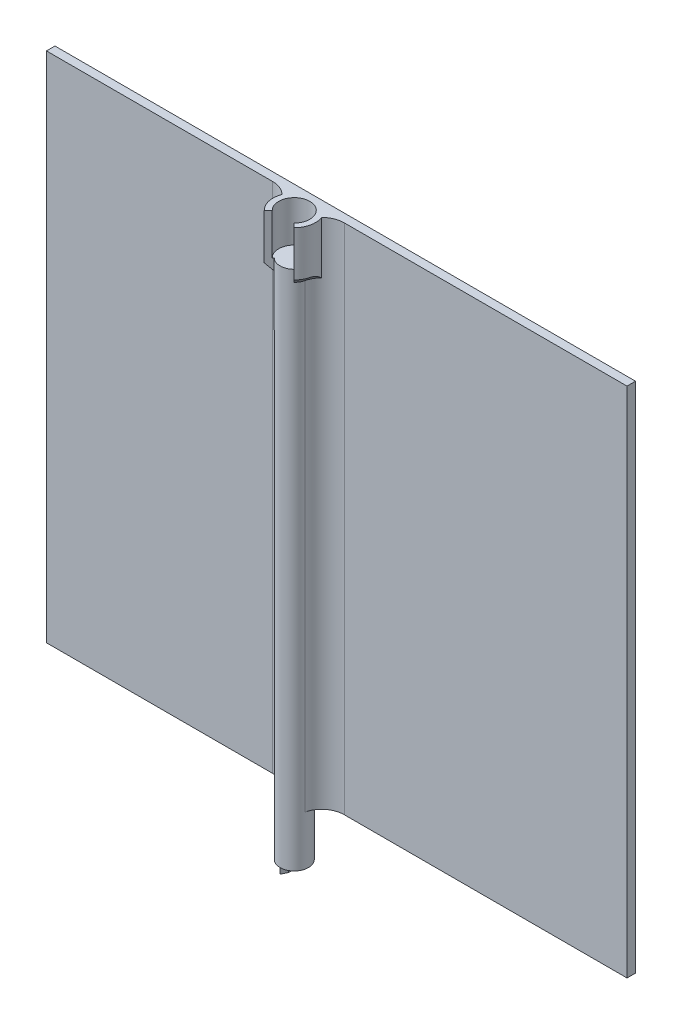
ISO-10303-21;
HEADER;
FILE_DESCRIPTION(('STEP AP214'),'2;1');
FILE_NAME('part.step','',(''),(''),'','','');
FILE_SCHEMA(('AUTOMOTIVE_DESIGN { 1 0 10303 214 1 1 1 1 }'));
ENDSEC;
DATA;
#1=APPLICATION_CONTEXT('core data for automotive mechanical design processes');
#2=APPLICATION_PROTOCOL_DEFINITION('international standard','automotive_design',2000,#1);
#3=PRODUCT_CONTEXT('',#1,'mechanical');
#4=PRODUCT('Part','Part','',(#3));
#5=PRODUCT_RELATED_PRODUCT_CATEGORY('part','',(#4));
#6=PRODUCT_DEFINITION_FORMATION('','',#4);
#7=PRODUCT_DEFINITION_CONTEXT('part definition',#1,'design');
#8=PRODUCT_DEFINITION('design','',#6,#7);
#9=PRODUCT_DEFINITION_SHAPE('','',#8);
#10=(LENGTH_UNIT() NAMED_UNIT(*) SI_UNIT(.MILLI.,.METRE.));
#11=(NAMED_UNIT(*) PLANE_ANGLE_UNIT() SI_UNIT($,.RADIAN.));
#12=(NAMED_UNIT(*) SI_UNIT($,.STERADIAN.) SOLID_ANGLE_UNIT());
#13=UNCERTAINTY_MEASURE_WITH_UNIT(LENGTH_MEASURE(1.E-05),#10,'distance_accuracy_value','');
#14=(GEOMETRIC_REPRESENTATION_CONTEXT(3) GLOBAL_UNCERTAINTY_ASSIGNED_CONTEXT((#13)) GLOBAL_UNIT_ASSIGNED_CONTEXT((#10,
#11,#12)) REPRESENTATION_CONTEXT('',''));
#15=CARTESIAN_POINT('',(0.,0.,0.));
#16=DIRECTION('',(0.,0.,1.));
#17=DIRECTION('',(1.,0.,0.));
#18=AXIS2_PLACEMENT_3D('',#15,#16,#17);
#19=CARTESIAN_POINT('',(0.,0.,3.));
#20=DIRECTION('',(0.,0.,-1.));
#21=DIRECTION('',(-1.,0.,0.));
#22=AXIS2_PLACEMENT_3D('',#19,#20,#21);
#23=PLANE('',#22);
#24=DIRECTION('',(-1.,0.,0.));
#25=VECTOR('',#24,1.);
#26=CARTESIAN_POINT('',(205.,5.,3.));
#27=LINE('',#26,#25);
#28=CARTESIAN_POINT('',(205.,5.,3.));
#29=VERTEX_POINT('',#28);
#30=CARTESIAN_POINT('',(105.149110640674,5.,3.));
#31=VERTEX_POINT('',#30);
#32=EDGE_CURVE('E600',#29,#31,#27,.T.);
#33=ORIENTED_EDGE('',*,*,#32,.F.);
#34=DIRECTION('',(0.,-1.,0.));
#35=VECTOR('',#34,1.);
#36=CARTESIAN_POINT('',(205.,190.223748416157,3.));
#37=LINE('',#36,#35);
#38=CARTESIAN_POINT('',(205.,186.,3.));
#39=VERTEX_POINT('',#38);
#40=EDGE_CURVE('E415',#39,#29,#37,.T.);
#41=ORIENTED_EDGE('',*,*,#40,.F.);
#42=DIRECTION('',(1.,0.,0.));
#43=VECTOR('',#42,1.);
#44=CARTESIAN_POINT('',(105.149110640674,186.,3.));
#45=LINE('',#44,#43);
#46=CARTESIAN_POINT('',(105.149110640674,186.,3.));
#47=VERTEX_POINT('',#46);
#48=EDGE_CURVE('E520',#47,#39,#45,.T.);
#49=ORIENTED_EDGE('',*,*,#48,.F.);
#50=DIRECTION('',(0.,1.,0.));
#51=VECTOR('',#50,1.);
#52=CARTESIAN_POINT('',(105.149110640674,0.,3.));
#53=LINE('',#52,#51);
#54=EDGE_CURVE('E240',#47,#31,#53,.F.);
#55=ORIENTED_EDGE('',*,*,#54,.T.);
#56=EDGE_LOOP('',(#33,#41,#49,#55));
#57=FACE_BOUND('',#56,.T.);
#58=ADVANCED_FACE('F53',(#57),#23,.F.);
#59=CARTESIAN_POINT('',(0.,0.,3.));
#60=DIRECTION('',(1.,0.,0.));
#61=DIRECTION('',(0.,0.,-1.));
#62=AXIS2_PLACEMENT_3D('',#59,#60,#61);
#63=PLANE('',#62);
#64=DIRECTION('',(0.,0.,-1.));
#65=VECTOR('',#64,1.);
#66=CARTESIAN_POINT('',(0.,5.,3.));
#67=LINE('',#66,#65);
#68=CARTESIAN_POINT('',(0.,5.,3.));
#69=VERTEX_POINT('',#68);
#70=CARTESIAN_POINT('',(0.,5.,0.));
#71=VERTEX_POINT('',#70);
#72=EDGE_CURVE('E232',#69,#71,#67,.T.);
#73=ORIENTED_EDGE('',*,*,#72,.F.);
#74=DIRECTION('',(0.,-1.,0.));
#75=VECTOR('',#74,1.);
#76=CARTESIAN_POINT('',(0.,0.,3.));
#77=LINE('',#76,#75);
#78=CARTESIAN_POINT('',(0.,186.,3.));
#79=VERTEX_POINT('',#78);
#80=EDGE_CURVE('E230',#79,#69,#77,.T.);
#81=ORIENTED_EDGE('',*,*,#80,.F.);
#82=DIRECTION('',(0.,0.,1.));
#83=VECTOR('',#82,1.);
#84=CARTESIAN_POINT('',(0.,186.,0.));
#85=LINE('',#84,#83);
#86=CARTESIAN_POINT('',(0.,186.,0.));
#87=VERTEX_POINT('',#86);
#88=EDGE_CURVE('E508',#87,#79,#85,.T.);
#89=ORIENTED_EDGE('',*,*,#88,.F.);
#90=DIRECTION('',(0.,-1.,0.));
#91=VECTOR('',#90,1.);
#92=CARTESIAN_POINT('',(0.,0.,0.));
#93=LINE('',#92,#91);
#94=EDGE_CURVE('E457',#87,#71,#93,.T.);
#95=ORIENTED_EDGE('',*,*,#94,.T.);
#96=EDGE_LOOP('',(#73,#81,#89,#95));
#97=FACE_BOUND('',#96,.T.);
#98=ADVANCED_FACE('F311',(#97),#63,.F.);
#99=DIRECTION('',(-1.,0.,0.));
#100=VECTOR('',#99,1.);
#101=CARTESIAN_POINT('',(79.8508893593265,5.,3.));
#102=LINE('',#101,#100);
#103=CARTESIAN_POINT('',(79.8508893593265,5.,3.));
#104=VERTEX_POINT('',#103);
#105=EDGE_CURVE('E214',#104,#69,#102,.T.);
#106=ORIENTED_EDGE('',*,*,#105,.F.);
#107=DIRECTION('',(0.,1.,0.));
#108=VECTOR('',#107,1.);
#109=CARTESIAN_POINT('',(79.8508893593265,0.,3.));
#110=LINE('',#109,#108);
#111=CARTESIAN_POINT('',(79.8508893593265,186.,3.00000000000001));
#112=VERTEX_POINT('',#111);
#113=EDGE_CURVE('E228',#104,#112,#110,.T.);
#114=ORIENTED_EDGE('',*,*,#113,.T.);
#115=DIRECTION('',(1.,0.,0.));
#116=VECTOR('',#115,1.);
#117=CARTESIAN_POINT('',(0.,186.,3.));
#118=LINE('',#117,#116);
#119=EDGE_CURVE('E505',#79,#112,#118,.T.);
#120=ORIENTED_EDGE('',*,*,#119,.F.);
#121=ORIENTED_EDGE('',*,*,#80,.T.);
#122=EDGE_LOOP('',(#106,#114,#120,#121));
#123=FACE_BOUND('',#122,.T.);
#124=ADVANCED_FACE('F226',(#123),#23,.F.);
#125=CARTESIAN_POINT('',(0.,0.,0.));
#126=DIRECTION('',(0.,0.,-1.));
#127=DIRECTION('',(-1.,0.,0.));
#128=AXIS2_PLACEMENT_3D('',#125,#126,#127);
#129=PLANE('',#128);
#130=DIRECTION('',(0.,-1.,0.));
#131=VECTOR('',#130,1.);
#132=CARTESIAN_POINT('',(205.,190.223748416157,0.));
#133=LINE('',#132,#131);
#134=CARTESIAN_POINT('',(205.,186.,0.));
#135=VERTEX_POINT('',#134);
#136=CARTESIAN_POINT('',(205.,5.,0.));
#137=VERTEX_POINT('',#136);
#138=EDGE_CURVE('E418',#135,#137,#133,.T.);
#139=ORIENTED_EDGE('',*,*,#138,.T.);
#140=DIRECTION('',(1.,0.,0.));
#141=VECTOR('',#140,1.);
#142=CARTESIAN_POINT('',(0.,5.,0.));
#143=LINE('',#142,#141);
#144=EDGE_CURVE('E72',#71,#137,#143,.T.);
#145=ORIENTED_EDGE('',*,*,#144,.F.);
#146=ORIENTED_EDGE('',*,*,#94,.F.);
#147=DIRECTION('',(-1.,0.,0.));
#148=VECTOR('',#147,1.);
#149=CARTESIAN_POINT('',(205.,186.,0.));
#150=LINE('',#149,#148);
#151=EDGE_CURVE('E512',#135,#87,#150,.T.);
#152=ORIENTED_EDGE('',*,*,#151,.F.);
#153=EDGE_LOOP('',(#139,#145,#146,#152));
#154=FACE_BOUND('',#153,.T.);
#155=ADVANCED_FACE('F324',(#154),#129,.T.);
#156=CARTESIAN_POINT('',(105.149110640674,-14.142135623731,11.));
#157=DIRECTION('',(0.,1.,0.));
#158=DIRECTION('',(0.,0.,1.));
#159=AXIS2_PLACEMENT_3D('',#156,#157,#158);
#160=CYLINDRICAL_SURFACE('',#159,8.);
#161=CARTESIAN_POINT('',(105.149110640674,5.,11.));
#162=DIRECTION('',(0.,1.,0.));
#163=DIRECTION('',(0.,0.,-1.));
#164=AXIS2_PLACEMENT_3D('',#161,#162,#163);
#165=CIRCLE('',#164,8.);
#166=CARTESIAN_POINT('',(97.3650425541052,5.,9.15384615384615));
#167=VERTEX_POINT('',#166);
#168=EDGE_CURVE('E604',#31,#167,#165,.T.);
#169=ORIENTED_EDGE('',*,*,#168,.F.);
#170=ORIENTED_EDGE('',*,*,#54,.F.);
#171=CARTESIAN_POINT('',(105.149110640674,186.,11.));
#172=DIRECTION('',(0.,1.,0.));
#173=DIRECTION('',(0.,0.,1.));
#174=AXIS2_PLACEMENT_3D('',#171,#172,#173);
#175=CIRCLE('',#174,8.);
#176=CARTESIAN_POINT('',(99.5077615383015,186.,5.32768298618929));
#177=VERTEX_POINT('',#176);
#178=EDGE_CURVE('E524',#177,#47,#175,.F.);
#179=ORIENTED_EDGE('',*,*,#178,.F.);
#180=DIRECTION('',(0.,-1.,0.));
#181=VECTOR('',#180,1.);
#182=CARTESIAN_POINT('',(99.5077615383015,391.06921808502,5.32768298618929));
#183=LINE('',#182,#181);
#184=CARTESIAN_POINT('',(99.5077615383015,167.5,5.32768298618928));
#185=VERTEX_POINT('',#184);
#186=EDGE_CURVE('E474',#177,#185,#183,.T.);
#187=ORIENTED_EDGE('',*,*,#186,.T.);
#188=CARTESIAN_POINT('',(105.149110640674,167.5,11.));
#189=DIRECTION('',(0.,1.,0.));
#190=DIRECTION('',(0.,0.,1.));
#191=AXIS2_PLACEMENT_3D('',#188,#189,#190);
#192=CIRCLE('',#191,8.);
#193=CARTESIAN_POINT('',(97.3650425541052,167.5,9.15384615384616));
#194=VERTEX_POINT('',#193);
#195=EDGE_CURVE('E254',#185,#194,#192,.T.);
#196=ORIENTED_EDGE('',*,*,#195,.T.);
#197=DIRECTION('',(0.,1.,0.));
#198=VECTOR('',#197,1.);
#199=CARTESIAN_POINT('',(97.3650425541052,-14.142135623731,9.15384615384616));
#200=LINE('',#199,#198);
#201=EDGE_CURVE('E247',#167,#194,#200,.T.);
#202=ORIENTED_EDGE('',*,*,#201,.F.);
#203=EDGE_LOOP('',(#169,#170,#179,#187,#196,#202));
#204=FACE_BOUND('',#203,.T.);
#205=ADVANCED_FACE('F328',(#204),#160,.F.);
#206=CARTESIAN_POINT('',(79.8508893593265,-14.142135623731,11.));
#207=DIRECTION('',(0.,1.,0.));
#208=DIRECTION('',(0.,0.,1.));
#209=AXIS2_PLACEMENT_3D('',#206,#207,#208);
#210=CYLINDRICAL_SURFACE('',#209,8.);
#211=CARTESIAN_POINT('',(79.8508893593265,5.,11.));
#212=DIRECTION('',(0.,1.,0.));
#213=DIRECTION('',(0.,0.,-1.));
#214=AXIS2_PLACEMENT_3D('',#211,#212,#213);
#215=CIRCLE('',#214,8.);
#216=CARTESIAN_POINT('',(87.6349574458948,5.,9.15384615384616));
#217=VERTEX_POINT('',#216);
#218=EDGE_CURVE('E211',#217,#104,#215,.T.);
#219=ORIENTED_EDGE('',*,*,#218,.F.);
#220=DIRECTION('',(0.,1.,0.));
#221=VECTOR('',#220,1.);
#222=CARTESIAN_POINT('',(87.6349574458948,-14.142135623731,9.15384615384616));
#223=LINE('',#222,#221);
#224=CARTESIAN_POINT('',(87.6349574458948,167.5,9.15384615384616));
#225=VERTEX_POINT('',#224);
#226=EDGE_CURVE('E460',#225,#217,#223,.F.);
#227=ORIENTED_EDGE('',*,*,#226,.F.);
#228=CARTESIAN_POINT('',(79.8508893593265,167.5,11.));
#229=DIRECTION('',(0.,1.,0.));
#230=DIRECTION('',(0.,0.,1.));
#231=AXIS2_PLACEMENT_3D('',#228,#229,#230);
#232=CIRCLE('',#231,8.);
#233=CARTESIAN_POINT('',(85.4922384616985,167.5,5.32768298618929));
#234=VERTEX_POINT('',#233);
#235=EDGE_CURVE('E258',#225,#234,#232,.T.);
#236=ORIENTED_EDGE('',*,*,#235,.T.);
#237=DIRECTION('',(0.,-1.,0.));
#238=VECTOR('',#237,1.);
#239=CARTESIAN_POINT('',(85.4922384616985,391.06921808502,5.32768298618929));
#240=LINE('',#239,#238);
#241=CARTESIAN_POINT('',(85.4922384616985,186.,5.32768298618929));
#242=VERTEX_POINT('',#241);
#243=EDGE_CURVE('E484',#242,#234,#240,.T.);
#244=ORIENTED_EDGE('',*,*,#243,.F.);
#245=CARTESIAN_POINT('',(79.8508893593265,186.,11.));
#246=DIRECTION('',(0.,1.,0.));
#247=DIRECTION('',(0.,0.,1.));
#248=AXIS2_PLACEMENT_3D('',#245,#246,#247);
#249=CIRCLE('',#248,7.99999999999999);
#250=EDGE_CURVE('E236',#112,#242,#249,.F.);
#251=ORIENTED_EDGE('',*,*,#250,.F.);
#252=ORIENTED_EDGE('',*,*,#113,.F.);
#253=EDGE_LOOP('',(#219,#227,#236,#244,#251,#252));
#254=FACE_BOUND('',#253,.T.);
#255=ADVANCED_FACE('F234',(#254),#210,.F.);
#256=CARTESIAN_POINT('',(205.,190.223748416157,3.));
#257=DIRECTION('',(1.,0.,0.));
#258=DIRECTION('',(0.,0.,-1.));
#259=AXIS2_PLACEMENT_3D('',#256,#257,#258);
#260=PLANE('',#259);
#261=ORIENTED_EDGE('',*,*,#40,.T.);
#262=DIRECTION('',(0.,0.,1.));
#263=VECTOR('',#262,1.);
#264=CARTESIAN_POINT('',(205.,5.,0.));
#265=LINE('',#264,#263);
#266=EDGE_CURVE('E598',#137,#29,#265,.T.);
#267=ORIENTED_EDGE('',*,*,#266,.F.);
#268=ORIENTED_EDGE('',*,*,#138,.F.);
#269=DIRECTION('',(0.,0.,-1.));
#270=VECTOR('',#269,1.);
#271=CARTESIAN_POINT('',(205.,186.,3.));
#272=LINE('',#271,#270);
#273=EDGE_CURVE('E516',#39,#135,#272,.T.);
#274=ORIENTED_EDGE('',*,*,#273,.F.);
#275=EDGE_LOOP('',(#261,#267,#268,#274));
#276=FACE_BOUND('',#275,.T.);
#277=ADVANCED_FACE('F337',(#276),#260,.T.);
#278=CARTESIAN_POINT('',(92.5,-14.142135623731,8.));
#279=DIRECTION('',(0.,1.,0.));
#280=DIRECTION('',(0.,0.,1.));
#281=AXIS2_PLACEMENT_3D('',#278,#279,#280);
#282=CYLINDRICAL_SURFACE('',#281,5.);
#283=CARTESIAN_POINT('',(92.5,5.,8.));
#284=DIRECTION('',(0.,1.,0.));
#285=DIRECTION('',(0.,0.,-1.));
#286=AXIS2_PLACEMENT_3D('',#283,#284,#285);
#287=CIRCLE('',#286,5.00000000000001);
#288=EDGE_CURVE('E217',#167,#217,#287,.T.);
#289=ORIENTED_EDGE('',*,*,#288,.F.);
#290=ORIENTED_EDGE('',*,*,#201,.T.);
#291=CARTESIAN_POINT('',(92.5,167.5,8.));
#292=DIRECTION('',(0.,1.,0.));
#293=DIRECTION('',(0.,0.,1.));
#294=AXIS2_PLACEMENT_3D('',#291,#292,#293);
#295=CIRCLE('',#294,5.);
#296=CARTESIAN_POINT('',(96.,167.5,11.5707142142714));
#297=VERTEX_POINT('',#296);
#298=EDGE_CURVE('E244',#194,#297,#295,.F.);
#299=ORIENTED_EDGE('',*,*,#298,.T.);
#300=DIRECTION('',(0.,-1.,0.));
#301=VECTOR('',#300,1.);
#302=CARTESIAN_POINT('',(96.,186.001,11.5707142142714));
#303=LINE('',#302,#301);
#304=CARTESIAN_POINT('',(96.,171.5,11.5707142142714));
#305=VERTEX_POINT('',#304);
#306=EDGE_CURVE('E541',#305,#297,#303,.T.);
#307=ORIENTED_EDGE('',*,*,#306,.F.);
#308=CARTESIAN_POINT('',(92.5,171.5,8.));
#309=DIRECTION('',(0.,1.,0.));
#310=DIRECTION('',(0.,0.,1.));
#311=AXIS2_PLACEMENT_3D('',#308,#309,#310);
#312=CIRCLE('',#311,5.00000000000001);
#313=CARTESIAN_POINT('',(89.,171.5,11.5707142142714));
#314=VERTEX_POINT('',#313);
#315=EDGE_CURVE('E556',#314,#305,#312,.T.);
#316=ORIENTED_EDGE('',*,*,#315,.F.);
#317=DIRECTION('',(0.,-1.,0.));
#318=VECTOR('',#317,1.);
#319=CARTESIAN_POINT('',(89.,186.001,11.5707142142714));
#320=LINE('',#319,#318);
#321=CARTESIAN_POINT('',(89.,167.5,11.5707142142714));
#322=VERTEX_POINT('',#321);
#323=EDGE_CURVE('E544',#314,#322,#320,.T.);
#324=ORIENTED_EDGE('',*,*,#323,.T.);
#325=CARTESIAN_POINT('',(92.5,167.5,8.));
#326=DIRECTION('',(0.,1.,0.));
#327=DIRECTION('',(0.,0.,1.));
#328=AXIS2_PLACEMENT_3D('',#325,#326,#327);
#329=CIRCLE('',#328,5.);
#330=EDGE_CURVE('E239',#322,#225,#329,.F.);
#331=ORIENTED_EDGE('',*,*,#330,.T.);
#332=ORIENTED_EDGE('',*,*,#226,.T.);
#333=EDGE_LOOP('',(#289,#290,#299,#307,#316,#324,#331,#332));
#334=FACE_BOUND('',#333,.T.);
#335=CARTESIAN_POINT('',(92.5,-12.5,8.));
#336=DIRECTION('',(0.,-1.,0.));
#337=DIRECTION('',(0.,0.,-1.));
#338=AXIS2_PLACEMENT_3D('',#335,#336,#337);
#339=CIRCLE('',#338,5.);
#340=CARTESIAN_POINT('',(92.5,-12.5,3.));
#341=VERTEX_POINT('',#340);
#342=CARTESIAN_POINT('',(92.5,-12.5,13.));
#343=VERTEX_POINT('',#342);
#344=EDGE_CURVE('E453',#341,#343,#339,.T.);
#345=ORIENTED_EDGE('',*,*,#344,.F.);
#346=EDGE_CURVE('E408',#343,#341,#339,.T.);
#347=ORIENTED_EDGE('',*,*,#346,.F.);
#348=EDGE_LOOP('',(#345,#347));
#349=FACE_BOUND('',#348,.T.);
#350=ADVANCED_FACE('F341',(#334,#349),#282,.T.);
#351=CARTESIAN_POINT('',(92.5,186.,8.));
#352=DIRECTION('',(0.,-1.,0.));
#353=DIRECTION('',(0.,0.,-1.));
#354=AXIS2_PLACEMENT_3D('',#351,#352,#353);
#355=CYLINDRICAL_SURFACE('',#354,7.50000000000001);
#356=ORIENTED_EDGE('',*,*,#186,.F.);
#357=CARTESIAN_POINT('',(92.5,186.,8.));
#358=DIRECTION('',(0.,1.,0.));
#359=DIRECTION('',(0.,0.,1.));
#360=AXIS2_PLACEMENT_3D('',#357,#358,#359);
#361=CIRCLE('',#360,7.50000000000001);
#362=CARTESIAN_POINT('',(97.75,186.,13.3560713214072));
#363=VERTEX_POINT('',#362);
#364=EDGE_CURVE('E563',#363,#177,#361,.T.);
#365=ORIENTED_EDGE('',*,*,#364,.F.);
#366=DIRECTION('',(0.,-1.,0.));
#367=VECTOR('',#366,1.);
#368=CARTESIAN_POINT('',(97.75,186.001,13.3560713214071));
#369=LINE('',#368,#367);
#370=CARTESIAN_POINT('',(97.75,170.,13.3560713214071));
#371=VERTEX_POINT('',#370);
#372=EDGE_CURVE('E537',#363,#371,#369,.T.);
#373=ORIENTED_EDGE('',*,*,#372,.T.);
#374=CARTESIAN_POINT('',(92.5,170.,8.));
#375=DIRECTION('',(0.,1.,0.));
#376=DIRECTION('',(0.,0.,1.));
#377=AXIS2_PLACEMENT_3D('',#374,#375,#376);
#378=CIRCLE('',#377,7.50000000000001);
#379=CARTESIAN_POINT('',(99.7975638311578,170.,9.73076923076923));
#380=VERTEX_POINT('',#379);
#381=EDGE_CURVE('E562',#371,#380,#378,.T.);
#382=ORIENTED_EDGE('',*,*,#381,.T.);
#383=CARTESIAN_POINT('',(99.7975638311578,170.,9.73076923076924));
#384=CARTESIAN_POINT('',(99.8201962867838,170.000071874496,9.63543521017515));
#385=CARTESIAN_POINT('',(99.8409088810974,169.995463694336,9.53969381961625));
#386=CARTESIAN_POINT('',(99.8784158059169,169.977452071494,9.3484684263812));
#387=CARTESIAN_POINT('',(99.895218076195,169.964066665536,9.25298429821501));
#388=CARTESIAN_POINT('',(99.9246257441988,169.929406680825,9.0648232000829));
#389=CARTESIAN_POINT('',(99.9373074311937,169.908293027109,8.97212802124504));
#390=CARTESIAN_POINT('',(99.9590454600218,169.858991928222,8.78817608474682));
#391=CARTESIAN_POINT('',(99.9680997748769,169.830800542283,8.6969201586242));
#392=CARTESIAN_POINT('',(99.9855173993743,169.756488099766,8.48227324621945));
#393=CARTESIAN_POINT('',(99.9923386923831,169.707612005695,8.3597112706458));
#394=CARTESIAN_POINT('',(100.000034258294,169.600515456726,8.11857036971126));
#395=CARTESIAN_POINT('',(100.000905935565,169.542290934738,7.99999320524356));
#396=CARTESIAN_POINT('',(99.9972544852059,169.417548246181,7.76508729219905));
#397=CARTESIAN_POINT('',(99.9926489266666,169.350917193574,7.64882036250319));
#398=CARTESIAN_POINT('',(99.978432445095,169.211707940315,7.42020028090427));
#399=CARTESIAN_POINT('',(99.968819527765,169.139127379845,7.30784870741854));
#400=CARTESIAN_POINT('',(99.9382099056176,168.946402927437,7.02345296437354));
#401=CARTESIAN_POINT('',(99.9138464995897,168.822834630541,6.8540914351595));
#402=CARTESIAN_POINT('',(99.8550854333523,168.567712790986,6.52319059364178));
#403=CARTESIAN_POINT('',(99.8206787368805,168.43615214214,6.361658478991));
#404=CARTESIAN_POINT('',(99.7441190421688,168.172277772443,6.05132313459902));
#405=CARTESIAN_POINT('',(99.7022896352171,168.040161798172,5.90227099632111));
#406=CARTESIAN_POINT('',(99.6336456440027,167.839326990074,5.68333723388971));
#407=CARTESIAN_POINT('',(99.6098091365596,167.772010713311,5.61120675766804));
#408=CARTESIAN_POINT('',(99.5602142920065,167.636576737665,5.46838309314809));
#409=CARTESIAN_POINT('',(99.5344560968063,167.568459098272,5.39768979920857));
#410=CARTESIAN_POINT('',(99.5077615383015,167.5,5.32768298618928));
#411=B_SPLINE_CURVE_WITH_KNOTS('',3,(#383,#384,#385,#386,#387,#388,#389,#390,#391,#392,#393,
#394,#395,#396,#397,#398,#399,#400,#401,#402,#403,#404,#405,#406,#407,#408,#409,#410),
.UNSPECIFIED.,.F.,.F.,(4,2,2,2,2,2,2,2,2,2,2,2,2,4),(0.,0.293749116612565,0.586896478496109,
0.874257915728502,1.16177970750038,1.55749154720012,1.9533760125396,2.35529460625013,
2.75737339596469,3.38983295772113,4.02286332637957,4.63309634552523,4.93757358493733,
5.24202836198309),.UNSPECIFIED.);
#412=EDGE_CURVE('E265',#380,#185,#411,.T.);
#413=ORIENTED_EDGE('',*,*,#412,.T.);
#414=EDGE_LOOP('',(#356,#365,#373,#382,#413));
#415=FACE_BOUND('',#414,.T.);
#416=ADVANCED_FACE('F279',(#415),#355,.T.);
#417=ORIENTED_EDGE('',*,*,#243,.T.);
#418=CARTESIAN_POINT('',(85.4922384616985,167.5,5.32768298618928));
#419=CARTESIAN_POINT('',(85.4617722844058,167.578131879212,5.40758353514013));
#420=CARTESIAN_POINT('',(85.4325252242345,167.655820019289,5.48837581205959));
#421=CARTESIAN_POINT('',(85.376541438332,167.810134983572,5.65184939678489));
#422=CARTESIAN_POINT('',(85.3498051513553,167.886761620294,5.73453103162656));
#423=CARTESIAN_POINT('',(85.2732755527246,168.115376278993,5.98621812586942));
#424=CARTESIAN_POINT('',(85.2274149000267,168.265449562082,6.15820638188103));
#425=CARTESIAN_POINT('',(85.1454737688333,168.56395151696,6.51799036748476));
#426=CARTESIAN_POINT('',(85.1098532272861,168.712078991326,6.70614248560044));
#427=CARTESIAN_POINT('',(85.0524527679631,168.996073760214,7.09321290457293));
#428=CARTESIAN_POINT('',(85.0306462889955,169.131964149318,7.29210974138864));
#429=CARTESIAN_POINT('',(85.0105973632104,169.3160741218,7.59064334358417));
#430=CARTESIAN_POINT('',(85.0059895831001,169.371712984647,7.68530249605927));
#431=CARTESIAN_POINT('',(85.0003861555197,169.478243627192,7.877397246771));
#432=CARTESIAN_POINT('',(84.9993907744316,169.52913505654,7.9748330492267));
#433=CARTESIAN_POINT('',(85.0013201657649,169.624482344453,8.17121296754092));
#434=CARTESIAN_POINT('',(85.0041937890188,169.669013730931,8.27012063901418));
#435=CARTESIAN_POINT('',(85.0141044408867,169.751220094265,8.47056288045693));
#436=CARTESIAN_POINT('',(85.0211407875799,169.788896192806,8.57209701756464));
#437=CARTESIAN_POINT('',(85.0381155359772,169.850365614392,8.76000128491225));
#438=CARTESIAN_POINT('',(85.0473578163174,169.875430052344,8.84601707364392));
#439=CARTESIAN_POINT('',(85.0690664818108,169.91917111767,9.01923742082542));
#440=CARTESIAN_POINT('',(85.0815315065788,169.937850432626,9.10644146301174));
#441=CARTESIAN_POINT('',(85.1100284827085,169.968429637059,9.28314139527603));
#442=CARTESIAN_POINT('',(85.1261209878257,169.980200517392,9.37265017771827));
#443=CARTESIAN_POINT('',(85.1617244192038,169.996020162218,9.55181686409718));
#444=CARTESIAN_POINT('',(85.1812408575192,170.00005634808,9.64147477401339));
#445=CARTESIAN_POINT('',(85.2024361688422,170.,9.73076923076923));
#446=B_SPLINE_CURVE_WITH_KNOTS('',3,(#418,#419,#420,#421,#422,#423,#424,#425,#426,#427,#428,
#429,#430,#431,#432,#433,#434,#435,#436,#437,#438,#439,#440,#441,#442,#443,#444,#445),
.UNSPECIFIED.,.F.,.F.,(4,2,2,2,2,2,2,2,2,2,2,2,2,4),(0.,0.347470583809489,0.695001775105053,
1.39293859532148,2.11855144427079,2.84276484157494,3.17230030645226,3.50186007111645,
3.82710548252774,4.1522976282721,4.42224264120375,4.69207389043959,4.96679567223754,
5.24196384546592),.UNSPECIFIED.);
#447=CARTESIAN_POINT('',(85.2024361688422,170.,9.73076923076923));
#448=VERTEX_POINT('',#447);
#449=EDGE_CURVE('E64',#234,#448,#446,.T.);
#450=ORIENTED_EDGE('',*,*,#449,.T.);
#451=CARTESIAN_POINT('',(87.25,170.,13.3560713214071));
#452=VERTEX_POINT('',#451);
#453=EDGE_CURVE('E569',#448,#452,#378,.T.);
#454=ORIENTED_EDGE('',*,*,#453,.T.);
#455=DIRECTION('',(0.,-1.,0.));
#456=VECTOR('',#455,1.);
#457=CARTESIAN_POINT('',(87.25,186.001,13.3560713214071));
#458=LINE('',#457,#456);
#459=CARTESIAN_POINT('',(87.25,186.,13.3560713214071));
#460=VERTEX_POINT('',#459);
#461=EDGE_CURVE('E536',#460,#452,#458,.T.);
#462=ORIENTED_EDGE('',*,*,#461,.F.);
#463=EDGE_CURVE('E567',#242,#460,#361,.T.);
#464=ORIENTED_EDGE('',*,*,#463,.F.);
#465=EDGE_LOOP('',(#417,#450,#454,#462,#464));
#466=FACE_BOUND('',#465,.T.);
#467=ADVANCED_FACE('F381',(#466),#355,.T.);
#468=CARTESIAN_POINT('',(92.5,-12.5,8.));
#469=DIRECTION('',(0.,-1.,0.));
#470=DIRECTION('',(0.,0.,-1.));
#471=AXIS2_PLACEMENT_3D('',#468,#469,#470);
#472=PLANE('',#471);
#473=DIRECTION('',(0.,0.,-1.));
#474=VECTOR('',#473,1.);
#475=CARTESIAN_POINT('',(91.5,-12.5,0.));
#476=LINE('',#475,#474);
#477=CARTESIAN_POINT('',(91.5,-12.5,11.));
#478=VERTEX_POINT('',#477);
#479=CARTESIAN_POINT('',(91.5,-12.5,5.));
#480=VERTEX_POINT('',#479);
#481=EDGE_CURVE('E390',#478,#480,#476,.T.);
#482=ORIENTED_EDGE('',*,*,#481,.F.);
#483=DIRECTION('',(0.447213595499958,0.,0.894427190999916));
#484=VECTOR('',#483,1.);
#485=CARTESIAN_POINT('',(68.8,-12.5,-34.4));
#486=LINE('',#485,#484);
#487=EDGE_CURVE('E394',#478,#343,#486,.T.);
#488=ORIENTED_EDGE('',*,*,#487,.T.);
#489=ORIENTED_EDGE('',*,*,#346,.T.);
#490=DIRECTION('',(0.447213595499957,0.,-0.894427190999916));
#491=VECTOR('',#490,1.);
#492=CARTESIAN_POINT('',(75.2,-12.5,37.6));
#493=LINE('',#492,#491);
#494=EDGE_CURVE('E397',#480,#341,#493,.T.);
#495=ORIENTED_EDGE('',*,*,#494,.F.);
#496=EDGE_LOOP('',(#482,#488,#489,#495));
#497=FACE_BOUND('',#496,.T.);
#498=ADVANCED_FACE('F379',(#497),#472,.T.);
#499=ORIENTED_EDGE('',*,*,#344,.T.);
#500=DIRECTION('',(0.447213595499958,0.,-0.894427190999916));
#501=VECTOR('',#500,1.);
#502=CARTESIAN_POINT('',(79.2,-12.5,39.6));
#503=LINE('',#502,#501);
#504=CARTESIAN_POINT('',(93.5,-12.5,11.));
#505=VERTEX_POINT('',#504);
#506=EDGE_CURVE('E433',#343,#505,#503,.T.);
#507=ORIENTED_EDGE('',*,*,#506,.T.);
#508=DIRECTION('',(0.,0.,-1.));
#509=VECTOR('',#508,1.);
#510=CARTESIAN_POINT('',(93.5,-12.5,0.));
#511=LINE('',#510,#509);
#512=CARTESIAN_POINT('',(93.5,-12.5,5.));
#513=VERTEX_POINT('',#512);
#514=EDGE_CURVE('E430',#505,#513,#511,.T.);
#515=ORIENTED_EDGE('',*,*,#514,.T.);
#516=DIRECTION('',(0.447213595499957,0.,0.894427190999916));
#517=VECTOR('',#516,1.);
#518=CARTESIAN_POINT('',(72.8000000000001,-12.5,-36.4));
#519=LINE('',#518,#517);
#520=EDGE_CURVE('E426',#341,#513,#519,.T.);
#521=ORIENTED_EDGE('',*,*,#520,.F.);
#522=EDGE_LOOP('',(#499,#507,#515,#521));
#523=FACE_BOUND('',#522,.T.);
#524=ADVANCED_FACE('F377',(#523),#472,.T.);
#525=CARTESIAN_POINT('',(68.8,-14.5,-34.4));
#526=DIRECTION('',(-0.894427190999916,0.,0.447213595499958));
#527=DIRECTION('',(0.447213595499958,0.,0.894427190999916));
#528=AXIS2_PLACEMENT_3D('',#525,#526,#527);
#529=PLANE('',#528);
#530=ORIENTED_EDGE('',*,*,#487,.F.);
#531=DIRECTION('',(0.,1.,0.));
#532=VECTOR('',#531,1.);
#533=CARTESIAN_POINT('',(91.5,-14.5,11.));
#534=LINE('',#533,#532);
#535=CARTESIAN_POINT('',(91.5,-14.5,11.));
#536=VERTEX_POINT('',#535);
#537=EDGE_CURVE('E403',#536,#478,#534,.T.);
#538=ORIENTED_EDGE('',*,*,#537,.F.);
#539=DIRECTION('',(0.447213595499958,0.,0.894427190999916));
#540=VECTOR('',#539,1.);
#541=CARTESIAN_POINT('',(68.8,-14.5,-34.4));
#542=LINE('',#541,#540);
#543=CARTESIAN_POINT('',(92.5,-14.5,13.));
#544=VERTEX_POINT('',#543);
#545=EDGE_CURVE('E436',#536,#544,#542,.T.);
#546=ORIENTED_EDGE('',*,*,#545,.T.);
#547=DIRECTION('',(0.,1.,0.));
#548=VECTOR('',#547,1.);
#549=CARTESIAN_POINT('',(92.5,-14.5,13.));
#550=LINE('',#549,#548);
#551=EDGE_CURVE('E412',#544,#343,#550,.T.);
#552=ORIENTED_EDGE('',*,*,#551,.T.);
#553=EDGE_LOOP('',(#530,#538,#546,#552));
#554=FACE_BOUND('',#553,.T.);
#555=ADVANCED_FACE('F373',(#554),#529,.T.);
#556=CARTESIAN_POINT('',(91.5,-14.5,0.));
#557=DIRECTION('',(1.,0.,0.));
#558=DIRECTION('',(0.,0.,-1.));
#559=AXIS2_PLACEMENT_3D('',#556,#557,#558);
#560=PLANE('',#559);
#561=ORIENTED_EDGE('',*,*,#481,.T.);
#562=DIRECTION('',(0.,1.,0.));
#563=VECTOR('',#562,1.);
#564=CARTESIAN_POINT('',(91.5,-14.5,5.));
#565=LINE('',#564,#563);
#566=CARTESIAN_POINT('',(91.5,-14.5,5.));
#567=VERTEX_POINT('',#566);
#568=EDGE_CURVE('E409',#567,#480,#565,.T.);
#569=ORIENTED_EDGE('',*,*,#568,.F.);
#570=DIRECTION('',(0.,0.,-1.));
#571=VECTOR('',#570,1.);
#572=CARTESIAN_POINT('',(91.5,-14.5,0.));
#573=LINE('',#572,#571);
#574=EDGE_CURVE('E404',#536,#567,#573,.T.);
#575=ORIENTED_EDGE('',*,*,#574,.F.);
#576=ORIENTED_EDGE('',*,*,#537,.T.);
#577=EDGE_LOOP('',(#561,#569,#575,#576));
#578=FACE_BOUND('',#577,.T.);
#579=ADVANCED_FACE('F369',(#578),#560,.F.);
#580=CARTESIAN_POINT('',(75.2,-14.5,37.6));
#581=DIRECTION('',(0.894427190999916,0.,0.447213595499957));
#582=DIRECTION('',(0.447213595499957,0.,-0.894427190999916));
#583=AXIS2_PLACEMENT_3D('',#580,#581,#582);
#584=PLANE('',#583);
#585=ORIENTED_EDGE('',*,*,#494,.T.);
#586=DIRECTION('',(0.,1.,0.));
#587=VECTOR('',#586,1.);
#588=CARTESIAN_POINT('',(92.5,-14.5,3.));
#589=LINE('',#588,#587);
#590=CARTESIAN_POINT('',(92.5,-14.5,3.));
#591=VERTEX_POINT('',#590);
#592=EDGE_CURVE('E447',#591,#341,#589,.T.);
#593=ORIENTED_EDGE('',*,*,#592,.F.);
#594=DIRECTION('',(0.447213595499957,0.,-0.894427190999916));
#595=VECTOR('',#594,1.);
#596=CARTESIAN_POINT('',(75.2,-14.5,37.6));
#597=LINE('',#596,#595);
#598=EDGE_CURVE('E577',#567,#591,#597,.T.);
#599=ORIENTED_EDGE('',*,*,#598,.F.);
#600=ORIENTED_EDGE('',*,*,#568,.T.);
#601=EDGE_LOOP('',(#585,#593,#599,#600));
#602=FACE_BOUND('',#601,.T.);
#603=ADVANCED_FACE('F365',(#602),#584,.F.);
#604=CARTESIAN_POINT('',(72.8000000000001,-14.5,-36.4));
#605=DIRECTION('',(-0.894427190999916,0.,0.447213595499957));
#606=DIRECTION('',(0.447213595499957,0.,0.894427190999916));
#607=AXIS2_PLACEMENT_3D('',#604,#605,#606);
#608=PLANE('',#607);
#609=ORIENTED_EDGE('',*,*,#520,.T.);
#610=DIRECTION('',(0.,1.,0.));
#611=VECTOR('',#610,1.);
#612=CARTESIAN_POINT('',(93.5,-14.5,5.));
#613=LINE('',#612,#611);
#614=CARTESIAN_POINT('',(93.5,-14.5,5.));
#615=VERTEX_POINT('',#614);
#616=EDGE_CURVE('E443',#615,#513,#613,.T.);
#617=ORIENTED_EDGE('',*,*,#616,.F.);
#618=DIRECTION('',(0.447213595499957,0.,0.894427190999916));
#619=VECTOR('',#618,1.);
#620=CARTESIAN_POINT('',(72.8000000000001,-14.5,-36.4));
#621=LINE('',#620,#619);
#622=EDGE_CURVE('E580',#591,#615,#621,.T.);
#623=ORIENTED_EDGE('',*,*,#622,.F.);
#624=ORIENTED_EDGE('',*,*,#592,.T.);
#625=EDGE_LOOP('',(#609,#617,#623,#624));
#626=FACE_BOUND('',#625,.T.);
#627=ADVANCED_FACE('F361',(#626),#608,.F.);
#628=CARTESIAN_POINT('',(93.5,-14.5,0.));
#629=DIRECTION('',(1.,0.,0.));
#630=DIRECTION('',(0.,0.,-1.));
#631=AXIS2_PLACEMENT_3D('',#628,#629,#630);
#632=PLANE('',#631);
#633=ORIENTED_EDGE('',*,*,#514,.F.);
#634=DIRECTION('',(0.,1.,0.));
#635=VECTOR('',#634,1.);
#636=CARTESIAN_POINT('',(93.5,-14.5,11.));
#637=LINE('',#636,#635);
#638=CARTESIAN_POINT('',(93.5,-14.5,11.));
#639=VERTEX_POINT('',#638);
#640=EDGE_CURVE('E439',#639,#505,#637,.T.);
#641=ORIENTED_EDGE('',*,*,#640,.F.);
#642=DIRECTION('',(0.,0.,-1.));
#643=VECTOR('',#642,1.);
#644=CARTESIAN_POINT('',(93.5,-14.5,0.));
#645=LINE('',#644,#643);
#646=EDGE_CURVE('E582',#639,#615,#645,.T.);
#647=ORIENTED_EDGE('',*,*,#646,.T.);
#648=ORIENTED_EDGE('',*,*,#616,.T.);
#649=EDGE_LOOP('',(#633,#641,#647,#648));
#650=FACE_BOUND('',#649,.T.);
#651=ADVANCED_FACE('F357',(#650),#632,.T.);
#652=CARTESIAN_POINT('',(79.2,-14.5,39.6));
#653=DIRECTION('',(0.894427190999916,0.,0.447213595499958));
#654=DIRECTION('',(0.447213595499958,0.,-0.894427190999916));
#655=AXIS2_PLACEMENT_3D('',#652,#653,#654);
#656=PLANE('',#655);
#657=ORIENTED_EDGE('',*,*,#506,.F.);
#658=ORIENTED_EDGE('',*,*,#551,.F.);
#659=DIRECTION('',(0.447213595499958,0.,-0.894427190999916));
#660=VECTOR('',#659,1.);
#661=CARTESIAN_POINT('',(79.2,-14.5,39.6));
#662=LINE('',#661,#660);
#663=EDGE_CURVE('E421',#544,#639,#662,.T.);
#664=ORIENTED_EDGE('',*,*,#663,.T.);
#665=ORIENTED_EDGE('',*,*,#640,.T.);
#666=EDGE_LOOP('',(#657,#658,#664,#665));
#667=FACE_BOUND('',#666,.T.);
#668=ADVANCED_FACE('F353',(#667),#656,.T.);
#669=CARTESIAN_POINT('',(0.,-14.5,0.));
#670=DIRECTION('',(0.,-1.,0.));
#671=DIRECTION('',(0.,0.,-1.));
#672=AXIS2_PLACEMENT_3D('',#669,#670,#671);
#673=PLANE('',#672);
#674=ORIENTED_EDGE('',*,*,#545,.F.);
#675=ORIENTED_EDGE('',*,*,#574,.T.);
#676=ORIENTED_EDGE('',*,*,#598,.T.);
#677=ORIENTED_EDGE('',*,*,#622,.T.);
#678=ORIENTED_EDGE('',*,*,#646,.F.);
#679=ORIENTED_EDGE('',*,*,#663,.F.);
#680=EDGE_LOOP('',(#674,#675,#676,#677,#678,#679));
#681=FACE_BOUND('',#680,.T.);
#682=ADVANCED_FACE('F349',(#681),#673,.T.);
#683=CARTESIAN_POINT('',(92.5,186.,8.));
#684=DIRECTION('',(0.,1.,0.));
#685=DIRECTION('',(0.,0.,1.));
#686=AXIS2_PLACEMENT_3D('',#683,#684,#685);
#687=PLANE('',#686);
#688=DIRECTION('',(0.699999999999999,0.,0.714142842854286));
#689=VECTOR('',#688,1.);
#690=CARTESIAN_POINT('',(96.,186.,11.5707142142714));
#691=LINE('',#690,#689);
#692=CARTESIAN_POINT('',(96.35,186.,11.9277856356986));
#693=VERTEX_POINT('',#692);
#694=EDGE_CURVE('E532',#693,#363,#691,.T.);
#695=ORIENTED_EDGE('',*,*,#694,.T.);
#696=ORIENTED_EDGE('',*,*,#364,.T.);
#697=ORIENTED_EDGE('',*,*,#178,.T.);
#698=ORIENTED_EDGE('',*,*,#48,.T.);
#699=ORIENTED_EDGE('',*,*,#273,.T.);
#700=ORIENTED_EDGE('',*,*,#151,.T.);
#701=ORIENTED_EDGE('',*,*,#88,.T.);
#702=ORIENTED_EDGE('',*,*,#119,.T.);
#703=ORIENTED_EDGE('',*,*,#250,.T.);
#704=ORIENTED_EDGE('',*,*,#463,.T.);
#705=DIRECTION('',(0.699999999999999,0.,-0.714142842854286));
#706=VECTOR('',#705,1.);
#707=CARTESIAN_POINT('',(87.25,186.,13.3560713214071));
#708=LINE('',#707,#706);
#709=CARTESIAN_POINT('',(88.65,186.,11.9277856356986));
#710=VERTEX_POINT('',#709);
#711=EDGE_CURVE('E552',#460,#710,#708,.T.);
#712=ORIENTED_EDGE('',*,*,#711,.T.);
#713=CARTESIAN_POINT('',(92.5,186.,8.));
#714=DIRECTION('',(0.,1.,0.));
#715=DIRECTION('',(0.,0.,1.));
#716=AXIS2_PLACEMENT_3D('',#713,#714,#715);
#717=CIRCLE('',#716,5.5);
#718=EDGE_CURVE('E559',#693,#710,#717,.T.);
#719=ORIENTED_EDGE('',*,*,#718,.F.);
#720=EDGE_LOOP('',(#695,#696,#697,#698,#699,#700,#701,#702,#703,#704,#712,#719));
#721=FACE_BOUND('',#720,.T.);
#722=ADVANCED_FACE('F352',(#721),#687,.T.);
#723=CARTESIAN_POINT('',(92.5,173.5,8.));
#724=DIRECTION('',(0.,1.,0.));
#725=DIRECTION('',(0.,0.,1.));
#726=AXIS2_PLACEMENT_3D('',#723,#724,#725);
#727=CYLINDRICAL_SURFACE('',#726,5.5);
#728=DIRECTION('',(0.,1.,0.));
#729=VECTOR('',#728,1.);
#730=CARTESIAN_POINT('',(88.65,173.5,11.9277856356986));
#731=LINE('',#730,#729);
#732=CARTESIAN_POINT('',(88.65,171.5,11.9277856356986));
#733=VERTEX_POINT('',#732);
#734=EDGE_CURVE('E80',#733,#710,#731,.T.);
#735=ORIENTED_EDGE('',*,*,#734,.F.);
#736=CARTESIAN_POINT('',(92.5,171.5,8.));
#737=DIRECTION('',(0.,1.,0.));
#738=DIRECTION('',(0.,0.,1.));
#739=AXIS2_PLACEMENT_3D('',#736,#737,#738);
#740=CIRCLE('',#739,5.5);
#741=CARTESIAN_POINT('',(96.35,171.5,11.9277856356986));
#742=VERTEX_POINT('',#741);
#743=EDGE_CURVE('E492',#742,#733,#740,.T.);
#744=ORIENTED_EDGE('',*,*,#743,.F.);
#745=DIRECTION('',(0.,1.,0.));
#746=VECTOR('',#745,1.);
#747=CARTESIAN_POINT('',(96.35,173.5,11.9277856356986));
#748=LINE('',#747,#746);
#749=EDGE_CURVE('E504',#693,#742,#748,.F.);
#750=ORIENTED_EDGE('',*,*,#749,.F.);
#751=ORIENTED_EDGE('',*,*,#718,.T.);
#752=EDGE_LOOP('',(#735,#744,#750,#751));
#753=FACE_BOUND('',#752,.T.);
#754=ADVANCED_FACE('F636',(#753),#727,.F.);
#755=CARTESIAN_POINT('',(0.,171.5,0.));
#756=DIRECTION('',(0.,1.,0.));
#757=DIRECTION('',(0.,0.,1.));
#758=AXIS2_PLACEMENT_3D('',#755,#756,#757);
#759=PLANE('',#758);
#760=ORIENTED_EDGE('',*,*,#315,.T.);
#761=DIRECTION('',(0.69999999999999,0.,0.714142842854295));
#762=VECTOR('',#761,1.);
#763=CARTESIAN_POINT('',(96.,171.5,11.5707142142714));
#764=LINE('',#763,#762);
#765=EDGE_CURVE('E498',#305,#742,#764,.T.);
#766=ORIENTED_EDGE('',*,*,#765,.T.);
#767=ORIENTED_EDGE('',*,*,#743,.T.);
#768=DIRECTION('',(0.699999999999995,0.,-0.71414284285429));
#769=VECTOR('',#768,1.);
#770=CARTESIAN_POINT('',(88.65,171.5,11.9277856356986));
#771=LINE('',#770,#769);
#772=EDGE_CURVE('E487',#733,#314,#771,.T.);
#773=ORIENTED_EDGE('',*,*,#772,.T.);
#774=EDGE_LOOP('',(#760,#766,#767,#773));
#775=FACE_BOUND('',#774,.T.);
#776=ADVANCED_FACE('F615',(#775),#759,.T.);
#777=CARTESIAN_POINT('',(96.,186.001,11.5707142142714));
#778=DIRECTION('',(0.714142842854286,0.,-0.699999999999999));
#779=DIRECTION('',(-0.699999999999999,0.,-0.714142842854286));
#780=AXIS2_PLACEMENT_3D('',#777,#778,#779);
#781=PLANE('',#780);
#782=ORIENTED_EDGE('',*,*,#749,.T.);
#783=ORIENTED_EDGE('',*,*,#765,.F.);
#784=ORIENTED_EDGE('',*,*,#306,.T.);
#785=DIRECTION('',(-0.494974746830584,-0.707106781186546,-0.504975246918106));
#786=VECTOR('',#785,1.);
#787=CARTESIAN_POINT('',(92.5,162.5,7.99999999999999));
#788=LINE('',#787,#786);
#789=EDGE_CURVE('E262',#297,#371,#788,.F.);
#790=ORIENTED_EDGE('',*,*,#789,.T.);
#791=ORIENTED_EDGE('',*,*,#372,.F.);
#792=ORIENTED_EDGE('',*,*,#694,.F.);
#793=EDGE_LOOP('',(#782,#783,#784,#790,#791,#792));
#794=FACE_BOUND('',#793,.T.);
#795=ADVANCED_FACE('F617',(#794),#781,.F.);
#796=CARTESIAN_POINT('',(87.25,186.001,13.3560713214071));
#797=DIRECTION('',(-0.714142842854286,0.,-0.699999999999999));
#798=DIRECTION('',(-0.699999999999999,0.,0.714142842854286));
#799=AXIS2_PLACEMENT_3D('',#796,#797,#798);
#800=PLANE('',#799);
#801=ORIENTED_EDGE('',*,*,#772,.F.);
#802=ORIENTED_EDGE('',*,*,#734,.T.);
#803=ORIENTED_EDGE('',*,*,#711,.F.);
#804=ORIENTED_EDGE('',*,*,#461,.T.);
#805=DIRECTION('',(-0.494974746830584,0.707106781186546,0.504975246918106));
#806=VECTOR('',#805,1.);
#807=CARTESIAN_POINT('',(92.5,162.5,8.));
#808=LINE('',#807,#806);
#809=EDGE_CURVE('E12',#452,#322,#808,.F.);
#810=ORIENTED_EDGE('',*,*,#809,.T.);
#811=ORIENTED_EDGE('',*,*,#323,.F.);
#812=EDGE_LOOP('',(#801,#802,#803,#804,#810,#811));
#813=FACE_BOUND('',#812,.T.);
#814=ADVANCED_FACE('F292',(#813),#800,.F.);
#815=CARTESIAN_POINT('',(105.149110640674,170.,11.));
#816=DIRECTION('',(0.,-1.,0.));
#817=DIRECTION('',(0.,0.,-1.));
#818=AXIS2_PLACEMENT_3D('',#815,#816,#817);
#819=CONICAL_SURFACE('',#818,5.49999999999995,0.785398163397451);
#820=ORIENTED_EDGE('',*,*,#195,.F.);
#821=ORIENTED_EDGE('',*,*,#412,.F.);
#822=DIRECTION('',(0.688020916153783,0.707106781186546,0.163178487966127));
#823=VECTOR('',#822,1.);
#824=CARTESIAN_POINT('',(97.3650425541052,167.5,9.15384615384616));
#825=LINE('',#824,#823);
#826=EDGE_CURVE('E479',#194,#380,#825,.T.);
#827=ORIENTED_EDGE('',*,*,#826,.F.);
#828=EDGE_LOOP('',(#820,#821,#827));
#829=FACE_BOUND('',#828,.T.);
#830=ADVANCED_FACE('F284',(#829),#819,.F.);
#831=CARTESIAN_POINT('',(92.5,170.,8.));
#832=DIRECTION('',(0.,1.,0.));
#833=DIRECTION('',(0.,0.,1.));
#834=AXIS2_PLACEMENT_3D('',#831,#832,#833);
#835=CONICAL_SURFACE('',#834,7.50000000000005,0.785398163397451);
#836=ORIENTED_EDGE('',*,*,#789,.F.);
#837=ORIENTED_EDGE('',*,*,#298,.F.);
#838=ORIENTED_EDGE('',*,*,#826,.T.);
#839=ORIENTED_EDGE('',*,*,#381,.F.);
#840=EDGE_LOOP('',(#836,#837,#838,#839));
#841=FACE_BOUND('',#840,.T.);
#842=ADVANCED_FACE('F291',(#841),#835,.T.);
#843=CARTESIAN_POINT('',(92.5,170.,8.));
#844=DIRECTION('',(0.,1.,0.));
#845=DIRECTION('',(0.,0.,1.));
#846=AXIS2_PLACEMENT_3D('',#843,#844,#845);
#847=CONICAL_SURFACE('',#846,7.50000000000002,0.785398163397451);
#848=ORIENTED_EDGE('',*,*,#809,.F.);
#849=ORIENTED_EDGE('',*,*,#453,.F.);
#850=DIRECTION('',(-0.688020916153782,0.707106781186546,0.163178487966127));
#851=VECTOR('',#850,1.);
#852=CARTESIAN_POINT('',(87.6349574458948,167.5,9.15384615384616));
#853=LINE('',#852,#851);
#854=EDGE_CURVE('E58',#225,#448,#853,.T.);
#855=ORIENTED_EDGE('',*,*,#854,.F.);
#856=ORIENTED_EDGE('',*,*,#330,.F.);
#857=EDGE_LOOP('',(#848,#849,#855,#856));
#858=FACE_BOUND('',#857,.T.);
#859=ADVANCED_FACE('F56',(#858),#847,.T.);
#860=CARTESIAN_POINT('',(79.8508893593265,170.,11.));
#861=DIRECTION('',(0.,-1.,0.));
#862=DIRECTION('',(0.,0.,-1.));
#863=AXIS2_PLACEMENT_3D('',#860,#861,#862);
#864=CONICAL_SURFACE('',#863,5.49999999999998,0.785398163397451);
#865=ORIENTED_EDGE('',*,*,#449,.F.);
#866=ORIENTED_EDGE('',*,*,#235,.F.);
#867=ORIENTED_EDGE('',*,*,#854,.T.);
#868=EDGE_LOOP('',(#865,#866,#867));
#869=FACE_BOUND('',#868,.T.);
#870=ADVANCED_FACE('F296',(#869),#864,.F.);
#871=CARTESIAN_POINT('',(79.8508893593265,5.,11.));
#872=DIRECTION('',(0.,-1.,0.));
#873=DIRECTION('',(0.,0.,-1.));
#874=AXIS2_PLACEMENT_3D('',#871,#872,#873);
#875=PLANE('',#874);
#876=ORIENTED_EDGE('',*,*,#218,.T.);
#877=ORIENTED_EDGE('',*,*,#105,.T.);
#878=ORIENTED_EDGE('',*,*,#72,.T.);
#879=ORIENTED_EDGE('',*,*,#144,.T.);
#880=ORIENTED_EDGE('',*,*,#266,.T.);
#881=ORIENTED_EDGE('',*,*,#32,.T.);
#882=ORIENTED_EDGE('',*,*,#168,.T.);
#883=ORIENTED_EDGE('',*,*,#288,.T.);
#884=EDGE_LOOP('',(#876,#877,#878,#879,#880,#881,#882,#883));
#885=FACE_BOUND('',#884,.T.);
#886=ADVANCED_FACE('F213',(#885),#875,.T.);
#887=CLOSED_SHELL('',(#58,#98,#124,#155,#205,#255,#277,#350,#416,#467,#498,#524,#555,#579,#603,
#627,#651,#668,#682,#722,#754,#776,#795,#814,#830,#842,#859,#870,#886));
#888=MANIFOLD_SOLID_BREP('B2',#887);
#889=ADVANCED_BREP_SHAPE_REPRESENTATION('',(#18,#888),#14);
#890=SHAPE_DEFINITION_REPRESENTATION(#9,#889);
ENDSEC;
END-ISO-10303-21;
